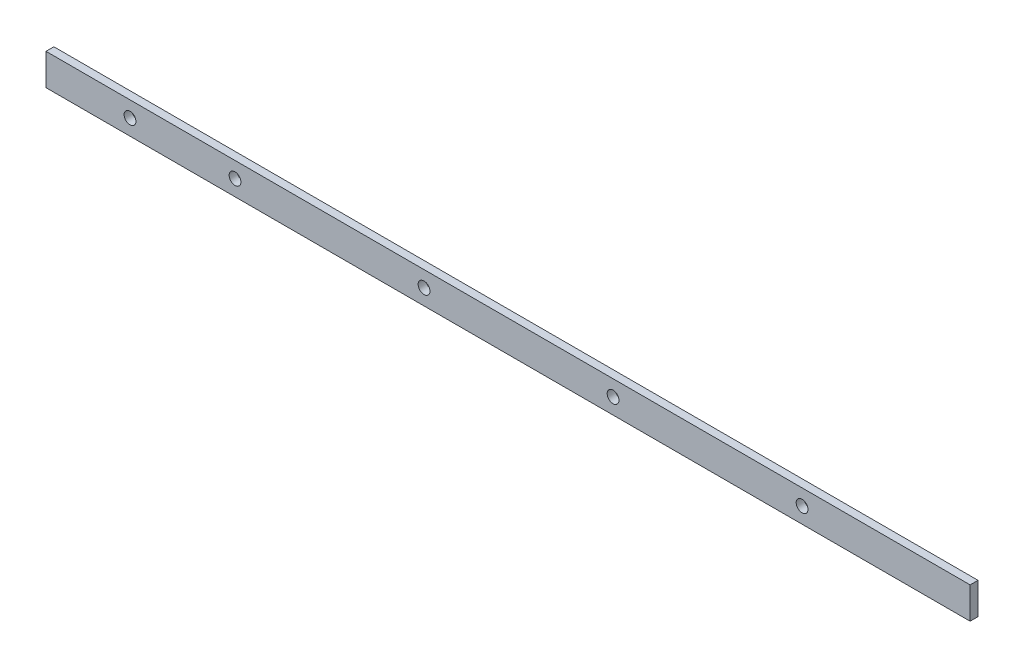
ISO-10303-21;
HEADER;
FILE_DESCRIPTION(('STEP AP214'),'2;1');
FILE_NAME('part.step','',(''),(''),'','','');
FILE_SCHEMA(('AUTOMOTIVE_DESIGN { 1 0 10303 214 1 1 1 1 }'));
ENDSEC;
DATA;
#1=APPLICATION_CONTEXT('core data for automotive mechanical design processes');
#2=APPLICATION_PROTOCOL_DEFINITION('international standard','automotive_design',2000,#1);
#3=PRODUCT_CONTEXT('',#1,'mechanical');
#4=PRODUCT('Part','Part','',(#3));
#5=PRODUCT_RELATED_PRODUCT_CATEGORY('part','',(#4));
#6=PRODUCT_DEFINITION_FORMATION('','',#4);
#7=PRODUCT_DEFINITION_CONTEXT('part definition',#1,'design');
#8=PRODUCT_DEFINITION('design','',#6,#7);
#9=PRODUCT_DEFINITION_SHAPE('','',#8);
#10=(LENGTH_UNIT() NAMED_UNIT(*) SI_UNIT(.MILLI.,.METRE.));
#11=(NAMED_UNIT(*) PLANE_ANGLE_UNIT() SI_UNIT($,.RADIAN.));
#12=(NAMED_UNIT(*) SI_UNIT($,.STERADIAN.) SOLID_ANGLE_UNIT());
#13=UNCERTAINTY_MEASURE_WITH_UNIT(LENGTH_MEASURE(1.E-05),#10,'distance_accuracy_value','');
#14=(GEOMETRIC_REPRESENTATION_CONTEXT(3) GLOBAL_UNCERTAINTY_ASSIGNED_CONTEXT((#13)) GLOBAL_UNIT_ASSIGNED_CONTEXT((#10,
#11,#12)) REPRESENTATION_CONTEXT('',''));
#15=CARTESIAN_POINT('',(0.,0.,0.));
#16=DIRECTION('',(0.,0.,1.));
#17=DIRECTION('',(1.,0.,0.));
#18=AXIS2_PLACEMENT_3D('',#15,#16,#17);
#19=CARTESIAN_POINT('',(0.,0.,4.7752));
#20=DIRECTION('',(1.,0.,0.));
#21=DIRECTION('',(0.,0.,-1.));
#22=AXIS2_PLACEMENT_3D('',#19,#20,#21);
#23=PLANE('',#22);
#24=DIRECTION('',(0.,-1.,0.));
#25=VECTOR('',#24,1.);
#26=CARTESIAN_POINT('',(0.,0.,0.));
#27=LINE('',#26,#25);
#28=CARTESIAN_POINT('',(0.,19.05,0.));
#29=VERTEX_POINT('',#28);
#30=CARTESIAN_POINT('',(0.,0.,0.));
#31=VERTEX_POINT('',#30);
#32=EDGE_CURVE('E102',#29,#31,#27,.T.);
#33=ORIENTED_EDGE('',*,*,#32,.T.);
#34=DIRECTION('',(0.,0.,-1.));
#35=VECTOR('',#34,1.);
#36=CARTESIAN_POINT('',(0.,0.,4.7752));
#37=LINE('',#36,#35);
#38=CARTESIAN_POINT('',(0.,0.,4.7752));
#39=VERTEX_POINT('',#38);
#40=EDGE_CURVE('E11',#39,#31,#37,.T.);
#41=ORIENTED_EDGE('',*,*,#40,.F.);
#42=DIRECTION('',(0.,-1.,0.));
#43=VECTOR('',#42,1.);
#44=CARTESIAN_POINT('',(0.,0.,4.7752));
#45=LINE('',#44,#43);
#46=CARTESIAN_POINT('',(0.,19.05,4.7752));
#47=VERTEX_POINT('',#46);
#48=EDGE_CURVE('E90',#47,#39,#45,.T.);
#49=ORIENTED_EDGE('',*,*,#48,.F.);
#50=DIRECTION('',(0.,0.,-1.));
#51=VECTOR('',#50,1.);
#52=CARTESIAN_POINT('',(0.,19.05,4.7752));
#53=LINE('',#52,#51);
#54=EDGE_CURVE('E98',#47,#29,#53,.T.);
#55=ORIENTED_EDGE('',*,*,#54,.T.);
#56=EDGE_LOOP('',(#33,#41,#49,#55));
#57=FACE_BOUND('',#56,.T.);
#58=ADVANCED_FACE('F39',(#57),#23,.F.);
#59=CARTESIAN_POINT('',(0.,0.,4.7752));
#60=DIRECTION('',(0.,1.,0.));
#61=DIRECTION('',(0.,0.,1.));
#62=AXIS2_PLACEMENT_3D('',#59,#60,#61);
#63=PLANE('',#62);
#64=DIRECTION('',(1.,0.,0.));
#65=VECTOR('',#64,1.);
#66=CARTESIAN_POINT('',(0.,0.,0.));
#67=LINE('',#66,#65);
#68=CARTESIAN_POINT('',(558.8,0.,0.));
#69=VERTEX_POINT('',#68);
#70=EDGE_CURVE('E94',#31,#69,#67,.T.);
#71=ORIENTED_EDGE('',*,*,#70,.T.);
#72=DIRECTION('',(0.,0.,-1.));
#73=VECTOR('',#72,1.);
#74=CARTESIAN_POINT('',(558.8,0.,4.7752));
#75=LINE('',#74,#73);
#76=CARTESIAN_POINT('',(558.8,0.,4.7752));
#77=VERTEX_POINT('',#76);
#78=EDGE_CURVE('E47',#77,#69,#75,.T.);
#79=ORIENTED_EDGE('',*,*,#78,.F.);
#80=DIRECTION('',(1.,0.,0.));
#81=VECTOR('',#80,1.);
#82=CARTESIAN_POINT('',(0.,0.,4.7752));
#83=LINE('',#82,#81);
#84=EDGE_CURVE('E85',#39,#77,#83,.T.);
#85=ORIENTED_EDGE('',*,*,#84,.F.);
#86=ORIENTED_EDGE('',*,*,#40,.T.);
#87=EDGE_LOOP('',(#71,#79,#85,#86));
#88=FACE_BOUND('',#87,.T.);
#89=ADVANCED_FACE('F93',(#88),#63,.F.);
#90=CARTESIAN_POINT('',(558.8,0.,4.7752));
#91=DIRECTION('',(-1.,0.,0.));
#92=DIRECTION('',(0.,0.,1.));
#93=AXIS2_PLACEMENT_3D('',#90,#91,#92);
#94=PLANE('',#93);
#95=DIRECTION('',(0.,1.,0.));
#96=VECTOR('',#95,1.);
#97=CARTESIAN_POINT('',(558.8,0.,0.));
#98=LINE('',#97,#96);
#99=CARTESIAN_POINT('',(558.8,19.05,0.));
#100=VERTEX_POINT('',#99);
#101=EDGE_CURVE('E72',#69,#100,#98,.T.);
#102=ORIENTED_EDGE('',*,*,#101,.T.);
#103=DIRECTION('',(0.,0.,-1.));
#104=VECTOR('',#103,1.);
#105=CARTESIAN_POINT('',(558.8,19.05,4.7752));
#106=LINE('',#105,#104);
#107=CARTESIAN_POINT('',(558.8,19.05,4.7752));
#108=VERTEX_POINT('',#107);
#109=EDGE_CURVE('E95',#108,#100,#106,.T.);
#110=ORIENTED_EDGE('',*,*,#109,.F.);
#111=DIRECTION('',(0.,1.,0.));
#112=VECTOR('',#111,1.);
#113=CARTESIAN_POINT('',(558.8,0.,4.7752));
#114=LINE('',#113,#112);
#115=EDGE_CURVE('E88',#77,#108,#114,.T.);
#116=ORIENTED_EDGE('',*,*,#115,.F.);
#117=ORIENTED_EDGE('',*,*,#78,.T.);
#118=EDGE_LOOP('',(#102,#110,#116,#117));
#119=FACE_BOUND('',#118,.T.);
#120=ADVANCED_FACE('F96',(#119),#94,.F.);
#121=CARTESIAN_POINT('',(0.,19.05,4.7752));
#122=DIRECTION('',(0.,-1.,0.));
#123=DIRECTION('',(0.,0.,-1.));
#124=AXIS2_PLACEMENT_3D('',#121,#122,#123);
#125=PLANE('',#124);
#126=DIRECTION('',(-1.,0.,0.));
#127=VECTOR('',#126,1.);
#128=CARTESIAN_POINT('',(0.,19.05,0.));
#129=LINE('',#128,#127);
#130=EDGE_CURVE('E78',#100,#29,#129,.T.);
#131=ORIENTED_EDGE('',*,*,#130,.T.);
#132=ORIENTED_EDGE('',*,*,#54,.F.);
#133=DIRECTION('',(-1.,0.,0.));
#134=VECTOR('',#133,1.);
#135=CARTESIAN_POINT('',(0.,19.05,4.7752));
#136=LINE('',#135,#134);
#137=EDGE_CURVE('E55',#108,#47,#136,.T.);
#138=ORIENTED_EDGE('',*,*,#137,.F.);
#139=ORIENTED_EDGE('',*,*,#109,.T.);
#140=EDGE_LOOP('',(#131,#132,#138,#139));
#141=FACE_BOUND('',#140,.T.);
#142=ADVANCED_FACE('F110',(#141),#125,.F.);
#143=CARTESIAN_POINT('',(0.,0.,4.7752));
#144=DIRECTION('',(0.,0.,-1.));
#145=DIRECTION('',(-1.,0.,0.));
#146=AXIS2_PLACEMENT_3D('',#143,#144,#145);
#147=PLANE('',#146);
#148=CARTESIAN_POINT('',(50.8,9.525,4.7752));
#149=DIRECTION('',(0.,0.,1.));
#150=DIRECTION('',(1.,0.,0.));
#151=AXIS2_PLACEMENT_3D('',#148,#149,#150);
#152=CIRCLE('',#151,3.5687);
#153=CARTESIAN_POINT('',(54.3687,9.525,4.7752));
#154=VERTEX_POINT('',#153);
#155=EDGE_CURVE('E105',#154,#154,#152,.T.);
#156=ORIENTED_EDGE('',*,*,#155,.F.);
#157=EDGE_LOOP('',(#156));
#158=FACE_BOUND('',#157,.T.);
#159=CARTESIAN_POINT('',(114.3,9.525,4.7752));
#160=DIRECTION('',(0.,0.,1.));
#161=DIRECTION('',(1.,0.,0.));
#162=AXIS2_PLACEMENT_3D('',#159,#160,#161);
#163=CIRCLE('',#162,3.5687);
#164=CARTESIAN_POINT('',(117.8687,9.525,4.7752));
#165=VERTEX_POINT('',#164);
#166=EDGE_CURVE('E134',#165,#165,#163,.T.);
#167=ORIENTED_EDGE('',*,*,#166,.F.);
#168=EDGE_LOOP('',(#167));
#169=FACE_BOUND('',#168,.T.);
#170=CARTESIAN_POINT('',(228.6,9.525,4.7752));
#171=DIRECTION('',(0.,0.,1.));
#172=DIRECTION('',(1.,0.,0.));
#173=AXIS2_PLACEMENT_3D('',#170,#171,#172);
#174=CIRCLE('',#173,3.56870000000001);
#175=CARTESIAN_POINT('',(232.1687,9.525,4.7752));
#176=VERTEX_POINT('',#175);
#177=EDGE_CURVE('E128',#176,#176,#174,.T.);
#178=ORIENTED_EDGE('',*,*,#177,.F.);
#179=EDGE_LOOP('',(#178));
#180=FACE_BOUND('',#179,.T.);
#181=CARTESIAN_POINT('',(342.9,9.525,4.7752));
#182=DIRECTION('',(0.,0.,1.));
#183=DIRECTION('',(1.,0.,0.));
#184=AXIS2_PLACEMENT_3D('',#181,#182,#183);
#185=CIRCLE('',#184,3.56869999999999);
#186=CARTESIAN_POINT('',(346.4687,9.525,4.7752));
#187=VERTEX_POINT('',#186);
#188=EDGE_CURVE('E122',#187,#187,#185,.T.);
#189=ORIENTED_EDGE('',*,*,#188,.F.);
#190=EDGE_LOOP('',(#189));
#191=FACE_BOUND('',#190,.T.);
#192=CARTESIAN_POINT('',(457.2,9.525,4.7752));
#193=DIRECTION('',(0.,0.,1.));
#194=DIRECTION('',(1.,0.,0.));
#195=AXIS2_PLACEMENT_3D('',#192,#193,#194);
#196=CIRCLE('',#195,3.56869999999999);
#197=CARTESIAN_POINT('',(460.7687,9.525,4.7752));
#198=VERTEX_POINT('',#197);
#199=EDGE_CURVE('E116',#198,#198,#196,.T.);
#200=ORIENTED_EDGE('',*,*,#199,.F.);
#201=EDGE_LOOP('',(#200));
#202=FACE_BOUND('',#201,.T.);
#203=ORIENTED_EDGE('',*,*,#48,.T.);
#204=ORIENTED_EDGE('',*,*,#84,.T.);
#205=ORIENTED_EDGE('',*,*,#115,.T.);
#206=ORIENTED_EDGE('',*,*,#137,.T.);
#207=EDGE_LOOP('',(#203,#204,#205,#206));
#208=FACE_BOUND('',#207,.T.);
#209=ADVANCED_FACE('F86',(#158,#169,#180,#191,#202,#208),#147,.F.);
#210=CARTESIAN_POINT('',(0.,0.,0.));
#211=DIRECTION('',(0.,0.,-1.));
#212=DIRECTION('',(-1.,0.,0.));
#213=AXIS2_PLACEMENT_3D('',#210,#211,#212);
#214=PLANE('',#213);
#215=CARTESIAN_POINT('',(50.8,9.525,0.));
#216=DIRECTION('',(0.,0.,1.));
#217=DIRECTION('',(1.,0.,0.));
#218=AXIS2_PLACEMENT_3D('',#215,#216,#217);
#219=CIRCLE('',#218,3.5687);
#220=CARTESIAN_POINT('',(54.3687,9.525,0.));
#221=VERTEX_POINT('',#220);
#222=EDGE_CURVE('E140',#221,#221,#219,.T.);
#223=ORIENTED_EDGE('',*,*,#222,.T.);
#224=EDGE_LOOP('',(#223));
#225=FACE_BOUND('',#224,.T.);
#226=CARTESIAN_POINT('',(114.3,9.525,0.));
#227=DIRECTION('',(0.,0.,1.));
#228=DIRECTION('',(1.,0.,0.));
#229=AXIS2_PLACEMENT_3D('',#226,#227,#228);
#230=CIRCLE('',#229,3.5687);
#231=CARTESIAN_POINT('',(117.8687,9.525,0.));
#232=VERTEX_POINT('',#231);
#233=EDGE_CURVE('E137',#232,#232,#230,.T.);
#234=ORIENTED_EDGE('',*,*,#233,.T.);
#235=EDGE_LOOP('',(#234));
#236=FACE_BOUND('',#235,.T.);
#237=CARTESIAN_POINT('',(228.6,9.525,0.));
#238=DIRECTION('',(0.,0.,1.));
#239=DIRECTION('',(1.,0.,0.));
#240=AXIS2_PLACEMENT_3D('',#237,#238,#239);
#241=CIRCLE('',#240,3.56870000000001);
#242=CARTESIAN_POINT('',(232.1687,9.525,0.));
#243=VERTEX_POINT('',#242);
#244=EDGE_CURVE('E131',#243,#243,#241,.T.);
#245=ORIENTED_EDGE('',*,*,#244,.T.);
#246=EDGE_LOOP('',(#245));
#247=FACE_BOUND('',#246,.T.);
#248=CARTESIAN_POINT('',(342.9,9.525,0.));
#249=DIRECTION('',(0.,0.,1.));
#250=DIRECTION('',(1.,0.,0.));
#251=AXIS2_PLACEMENT_3D('',#248,#249,#250);
#252=CIRCLE('',#251,3.56869999999999);
#253=CARTESIAN_POINT('',(346.4687,9.525,0.));
#254=VERTEX_POINT('',#253);
#255=EDGE_CURVE('E125',#254,#254,#252,.T.);
#256=ORIENTED_EDGE('',*,*,#255,.T.);
#257=EDGE_LOOP('',(#256));
#258=FACE_BOUND('',#257,.T.);
#259=CARTESIAN_POINT('',(457.2,9.525,0.));
#260=DIRECTION('',(0.,0.,1.));
#261=DIRECTION('',(1.,0.,0.));
#262=AXIS2_PLACEMENT_3D('',#259,#260,#261);
#263=CIRCLE('',#262,3.56869999999999);
#264=CARTESIAN_POINT('',(460.7687,9.525,0.));
#265=VERTEX_POINT('',#264);
#266=EDGE_CURVE('E119',#265,#265,#263,.T.);
#267=ORIENTED_EDGE('',*,*,#266,.T.);
#268=EDGE_LOOP('',(#267));
#269=FACE_BOUND('',#268,.T.);
#270=ORIENTED_EDGE('',*,*,#32,.F.);
#271=ORIENTED_EDGE('',*,*,#130,.F.);
#272=ORIENTED_EDGE('',*,*,#101,.F.);
#273=ORIENTED_EDGE('',*,*,#70,.F.);
#274=EDGE_LOOP('',(#270,#271,#272,#273));
#275=FACE_BOUND('',#274,.T.);
#276=ADVANCED_FACE('F113',(#225,#236,#247,#258,#269,#275),#214,.T.);
#277=CARTESIAN_POINT('',(457.2,9.525,4.7752));
#278=DIRECTION('',(0.,0.,-1.));
#279=DIRECTION('',(-1.,0.,0.));
#280=AXIS2_PLACEMENT_3D('',#277,#278,#279);
#281=CYLINDRICAL_SURFACE('',#280,3.56869999999999);
#282=ORIENTED_EDGE('',*,*,#199,.T.);
#283=EDGE_LOOP('',(#282));
#284=FACE_BOUND('',#283,.T.);
#285=ORIENTED_EDGE('',*,*,#266,.F.);
#286=EDGE_LOOP('',(#285));
#287=FACE_BOUND('',#286,.T.);
#288=ADVANCED_FACE('F160',(#284,#287),#281,.F.);
#289=CARTESIAN_POINT('',(342.9,9.525,4.7752));
#290=DIRECTION('',(0.,0.,-1.));
#291=DIRECTION('',(-1.,0.,0.));
#292=AXIS2_PLACEMENT_3D('',#289,#290,#291);
#293=CYLINDRICAL_SURFACE('',#292,3.56869999999999);
#294=ORIENTED_EDGE('',*,*,#188,.T.);
#295=EDGE_LOOP('',(#294));
#296=FACE_BOUND('',#295,.T.);
#297=ORIENTED_EDGE('',*,*,#255,.F.);
#298=EDGE_LOOP('',(#297));
#299=FACE_BOUND('',#298,.T.);
#300=ADVANCED_FACE('F163',(#296,#299),#293,.F.);
#301=CARTESIAN_POINT('',(228.6,9.525,4.7752));
#302=DIRECTION('',(0.,0.,-1.));
#303=DIRECTION('',(-1.,0.,0.));
#304=AXIS2_PLACEMENT_3D('',#301,#302,#303);
#305=CYLINDRICAL_SURFACE('',#304,3.56870000000001);
#306=ORIENTED_EDGE('',*,*,#177,.T.);
#307=EDGE_LOOP('',(#306));
#308=FACE_BOUND('',#307,.T.);
#309=ORIENTED_EDGE('',*,*,#244,.F.);
#310=EDGE_LOOP('',(#309));
#311=FACE_BOUND('',#310,.T.);
#312=ADVANCED_FACE('F212',(#308,#311),#305,.F.);
#313=CARTESIAN_POINT('',(114.3,9.525,4.7752));
#314=DIRECTION('',(0.,0.,-1.));
#315=DIRECTION('',(-1.,0.,0.));
#316=AXIS2_PLACEMENT_3D('',#313,#314,#315);
#317=CYLINDRICAL_SURFACE('',#316,3.5687);
#318=ORIENTED_EDGE('',*,*,#166,.T.);
#319=EDGE_LOOP('',(#318));
#320=FACE_BOUND('',#319,.T.);
#321=ORIENTED_EDGE('',*,*,#233,.F.);
#322=EDGE_LOOP('',(#321));
#323=FACE_BOUND('',#322,.T.);
#324=ADVANCED_FACE('F222',(#320,#323),#317,.F.);
#325=CARTESIAN_POINT('',(50.8,9.525,4.7752));
#326=DIRECTION('',(0.,0.,-1.));
#327=DIRECTION('',(-1.,0.,0.));
#328=AXIS2_PLACEMENT_3D('',#325,#326,#327);
#329=CYLINDRICAL_SURFACE('',#328,3.5687);
#330=ORIENTED_EDGE('',*,*,#155,.T.);
#331=EDGE_LOOP('',(#330));
#332=FACE_BOUND('',#331,.T.);
#333=ORIENTED_EDGE('',*,*,#222,.F.);
#334=EDGE_LOOP('',(#333));
#335=FACE_BOUND('',#334,.T.);
#336=ADVANCED_FACE('F146',(#332,#335),#329,.F.);
#337=CLOSED_SHELL('',(#58,#89,#120,#142,#209,#276,#288,#300,#312,#324,#336));
#338=MANIFOLD_SOLID_BREP('B2',#337);
#339=ADVANCED_BREP_SHAPE_REPRESENTATION('',(#18,#338),#14);
#340=SHAPE_DEFINITION_REPRESENTATION(#9,#339);
ENDSEC;
END-ISO-10303-21;
